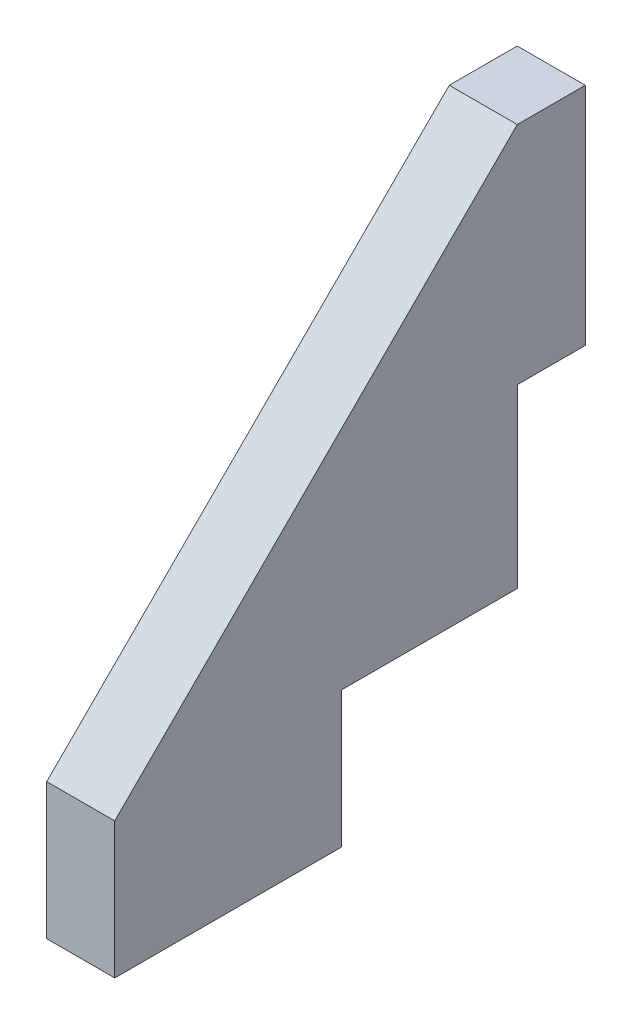
ISO-10303-21;
HEADER;
FILE_DESCRIPTION(('STEP AP214'),'2;1');
FILE_NAME('part.step','',(''),(''),'','','');
FILE_SCHEMA(('AUTOMOTIVE_DESIGN { 1 0 10303 214 1 1 1 1 }'));
ENDSEC;
DATA;
#1=APPLICATION_CONTEXT('core data for automotive mechanical design processes');
#2=APPLICATION_PROTOCOL_DEFINITION('international standard','automotive_design',2000,#1);
#3=PRODUCT_CONTEXT('',#1,'mechanical');
#4=PRODUCT('Part','Part','',(#3));
#5=PRODUCT_RELATED_PRODUCT_CATEGORY('part','',(#4));
#6=PRODUCT_DEFINITION_FORMATION('','',#4);
#7=PRODUCT_DEFINITION_CONTEXT('part definition',#1,'design');
#8=PRODUCT_DEFINITION('design','',#6,#7);
#9=PRODUCT_DEFINITION_SHAPE('','',#8);
#10=(LENGTH_UNIT() NAMED_UNIT(*) SI_UNIT(.MILLI.,.METRE.));
#11=(NAMED_UNIT(*) PLANE_ANGLE_UNIT() SI_UNIT($,.RADIAN.));
#12=(NAMED_UNIT(*) SI_UNIT($,.STERADIAN.) SOLID_ANGLE_UNIT());
#13=UNCERTAINTY_MEASURE_WITH_UNIT(LENGTH_MEASURE(1.E-05),#10,'distance_accuracy_value','');
#14=(GEOMETRIC_REPRESENTATION_CONTEXT(3) GLOBAL_UNCERTAINTY_ASSIGNED_CONTEXT((#13)) GLOBAL_UNIT_ASSIGNED_CONTEXT((#10,
#11,#12)) REPRESENTATION_CONTEXT('',''));
#15=CARTESIAN_POINT('',(0.,0.,0.));
#16=DIRECTION('',(0.,0.,1.));
#17=DIRECTION('',(1.,0.,0.));
#18=AXIS2_PLACEMENT_3D('',#15,#16,#17);
#19=CARTESIAN_POINT('',(3.,1.49999750889235,1.49726626322706));
#20=DIRECTION('',(0.,0.707750835810865,0.706462139402404));
#21=DIRECTION('',(0.,-0.706462139402404,0.707750835810865));
#22=AXIS2_PLACEMENT_3D('',#19,#20,#21);
#23=PLANE('',#22);
#24=DIRECTION('',(0.,0.706462139402404,-0.707750835810865));
#25=VECTOR('',#24,1.);
#26=CARTESIAN_POINT('',(0.,1.49999750889235,1.49726626322706));
#27=LINE('',#26,#25);
#28=CARTESIAN_POINT('',(0.,-17.7176802059527,20.75));
#29=VERTEX_POINT('',#28);
#30=CARTESIAN_POINT('',(0.,0.,3.));
#31=VERTEX_POINT('',#30);
#32=EDGE_CURVE('E133',#29,#31,#27,.T.);
#33=ORIENTED_EDGE('',*,*,#32,.F.);
#34=DIRECTION('',(-1.,0.,0.));
#35=VECTOR('',#34,1.);
#36=CARTESIAN_POINT('',(3.,-17.7176802059527,20.75));
#37=LINE('',#36,#35);
#38=CARTESIAN_POINT('',(3.,-17.7176802059527,20.75));
#39=VERTEX_POINT('',#38);
#40=EDGE_CURVE('E11',#39,#29,#37,.T.);
#41=ORIENTED_EDGE('',*,*,#40,.F.);
#42=DIRECTION('',(0.,0.706462139402404,-0.707750835810865));
#43=VECTOR('',#42,1.);
#44=CARTESIAN_POINT('',(3.,1.49999750889235,1.49726626322706));
#45=LINE('',#44,#43);
#46=CARTESIAN_POINT('',(3.,0.,3.));
#47=VERTEX_POINT('',#46);
#48=EDGE_CURVE('E155',#39,#47,#45,.T.);
#49=ORIENTED_EDGE('',*,*,#48,.T.);
#50=DIRECTION('',(-1.,0.,0.));
#51=VECTOR('',#50,1.);
#52=CARTESIAN_POINT('',(3.,0.,3.));
#53=LINE('',#52,#51);
#54=EDGE_CURVE('E87',#47,#31,#53,.T.);
#55=ORIENTED_EDGE('',*,*,#54,.T.);
#56=EDGE_LOOP('',(#33,#41,#49,#55));
#57=FACE_BOUND('',#56,.T.);
#58=ADVANCED_FACE('F34',(#57),#23,.T.);
#59=CARTESIAN_POINT('',(3.,0.,20.75));
#60=DIRECTION('',(0.,0.,-1.));
#61=DIRECTION('',(-1.,0.,0.));
#62=AXIS2_PLACEMENT_3D('',#59,#60,#61);
#63=PLANE('',#62);
#64=DIRECTION('',(0.,-1.,0.));
#65=VECTOR('',#64,1.);
#66=CARTESIAN_POINT('',(0.,0.,20.75));
#67=LINE('',#66,#65);
#68=CARTESIAN_POINT('',(0.,-23.7176802059527,20.75));
#69=VERTEX_POINT('',#68);
#70=EDGE_CURVE('E136',#29,#69,#67,.T.);
#71=ORIENTED_EDGE('',*,*,#70,.T.);
#72=DIRECTION('',(-1.,0.,0.));
#73=VECTOR('',#72,1.);
#74=CARTESIAN_POINT('',(3.,-23.7176802059527,20.75));
#75=LINE('',#74,#73);
#76=CARTESIAN_POINT('',(3.,-23.7176802059527,20.75));
#77=VERTEX_POINT('',#76);
#78=EDGE_CURVE('E42',#77,#69,#75,.T.);
#79=ORIENTED_EDGE('',*,*,#78,.F.);
#80=DIRECTION('',(0.,-1.,0.));
#81=VECTOR('',#80,1.);
#82=CARTESIAN_POINT('',(3.,0.,20.75));
#83=LINE('',#82,#81);
#84=EDGE_CURVE('E187',#39,#77,#83,.T.);
#85=ORIENTED_EDGE('',*,*,#84,.F.);
#86=ORIENTED_EDGE('',*,*,#40,.T.);
#87=EDGE_LOOP('',(#71,#79,#85,#86));
#88=FACE_BOUND('',#87,.T.);
#89=ADVANCED_FACE('F196',(#88),#63,.F.);
#90=CARTESIAN_POINT('',(3.,-23.7176802059527,0.));
#91=DIRECTION('',(0.,1.,0.));
#92=DIRECTION('',(0.,0.,1.));
#93=AXIS2_PLACEMENT_3D('',#90,#91,#92);
#94=PLANE('',#93);
#95=DIRECTION('',(0.,0.,-1.));
#96=VECTOR('',#95,1.);
#97=CARTESIAN_POINT('',(0.,-23.7176802059527,0.));
#98=LINE('',#97,#96);
#99=CARTESIAN_POINT('',(0.,-23.7176802059527,10.75));
#100=VERTEX_POINT('',#99);
#101=EDGE_CURVE('E138',#69,#100,#98,.T.);
#102=ORIENTED_EDGE('',*,*,#101,.T.);
#103=DIRECTION('',(-1.,0.,0.));
#104=VECTOR('',#103,1.);
#105=CARTESIAN_POINT('',(3.,-23.7176802059527,10.75));
#106=LINE('',#105,#104);
#107=CARTESIAN_POINT('',(3.,-23.7176802059527,10.75));
#108=VERTEX_POINT('',#107);
#109=EDGE_CURVE('E163',#108,#100,#106,.T.);
#110=ORIENTED_EDGE('',*,*,#109,.F.);
#111=DIRECTION('',(0.,0.,-1.));
#112=VECTOR('',#111,1.);
#113=CARTESIAN_POINT('',(3.,-23.7176802059527,0.));
#114=LINE('',#113,#112);
#115=EDGE_CURVE('E171',#77,#108,#114,.T.);
#116=ORIENTED_EDGE('',*,*,#115,.F.);
#117=ORIENTED_EDGE('',*,*,#78,.T.);
#118=EDGE_LOOP('',(#102,#110,#116,#117));
#119=FACE_BOUND('',#118,.T.);
#120=ADVANCED_FACE('F169',(#119),#94,.F.);
#121=CARTESIAN_POINT('',(3.,0.,10.75));
#122=DIRECTION('',(0.,0.,-1.));
#123=DIRECTION('',(-1.,0.,0.));
#124=AXIS2_PLACEMENT_3D('',#121,#122,#123);
#125=PLANE('',#124);
#126=DIRECTION('',(0.,-1.,0.));
#127=VECTOR('',#126,1.);
#128=CARTESIAN_POINT('',(0.,0.,10.75));
#129=LINE('',#128,#127);
#130=CARTESIAN_POINT('',(0.,-17.7176802059527,10.75));
#131=VERTEX_POINT('',#130);
#132=EDGE_CURVE('E141',#131,#100,#129,.T.);
#133=ORIENTED_EDGE('',*,*,#132,.F.);
#134=DIRECTION('',(-1.,0.,0.));
#135=VECTOR('',#134,1.);
#136=CARTESIAN_POINT('',(3.,-17.7176802059527,10.75));
#137=LINE('',#136,#135);
#138=CARTESIAN_POINT('',(3.,-17.7176802059527,10.75));
#139=VERTEX_POINT('',#138);
#140=EDGE_CURVE('E161',#139,#131,#137,.T.);
#141=ORIENTED_EDGE('',*,*,#140,.F.);
#142=DIRECTION('',(0.,-1.,0.));
#143=VECTOR('',#142,1.);
#144=CARTESIAN_POINT('',(3.,0.,10.75));
#145=LINE('',#144,#143);
#146=EDGE_CURVE('E183',#139,#108,#145,.T.);
#147=ORIENTED_EDGE('',*,*,#146,.T.);
#148=ORIENTED_EDGE('',*,*,#109,.T.);
#149=EDGE_LOOP('',(#133,#141,#147,#148));
#150=FACE_BOUND('',#149,.T.);
#151=ADVANCED_FACE('F179',(#150),#125,.T.);
#152=CARTESIAN_POINT('',(3.,-17.7176802059527,0.));
#153=DIRECTION('',(0.,1.,0.));
#154=DIRECTION('',(0.,0.,1.));
#155=AXIS2_PLACEMENT_3D('',#152,#153,#154);
#156=PLANE('',#155);
#157=DIRECTION('',(0.,0.,-1.));
#158=VECTOR('',#157,1.);
#159=CARTESIAN_POINT('',(0.,-17.7176802059527,0.));
#160=LINE('',#159,#158);
#161=CARTESIAN_POINT('',(0.,-17.7176802059527,3.));
#162=VERTEX_POINT('',#161);
#163=EDGE_CURVE('E144',#131,#162,#160,.T.);
#164=ORIENTED_EDGE('',*,*,#163,.T.);
#165=DIRECTION('',(-1.,0.,0.));
#166=VECTOR('',#165,1.);
#167=CARTESIAN_POINT('',(3.,-17.7176802059527,3.));
#168=LINE('',#167,#166);
#169=CARTESIAN_POINT('',(3.,-17.7176802059527,3.));
#170=VERTEX_POINT('',#169);
#171=EDGE_CURVE('E159',#170,#162,#168,.T.);
#172=ORIENTED_EDGE('',*,*,#171,.F.);
#173=DIRECTION('',(0.,0.,-1.));
#174=VECTOR('',#173,1.);
#175=CARTESIAN_POINT('',(3.,-17.7176802059527,0.));
#176=LINE('',#175,#174);
#177=EDGE_CURVE('E184',#139,#170,#176,.T.);
#178=ORIENTED_EDGE('',*,*,#177,.F.);
#179=ORIENTED_EDGE('',*,*,#140,.T.);
#180=EDGE_LOOP('',(#164,#172,#178,#179));
#181=FACE_BOUND('',#180,.T.);
#182=ADVANCED_FACE('F206',(#181),#156,.F.);
#183=CARTESIAN_POINT('',(3.,0.,3.));
#184=DIRECTION('',(0.,0.,-1.));
#185=DIRECTION('',(0.,1.,0.));
#186=AXIS2_PLACEMENT_3D('',#183,#184,#185);
#187=PLANE('',#186);
#188=DIRECTION('',(0.,-1.,0.));
#189=VECTOR('',#188,1.);
#190=CARTESIAN_POINT('',(0.,0.,3.));
#191=LINE('',#190,#189);
#192=CARTESIAN_POINT('',(0.,-9.93536041190545,3.));
#193=VERTEX_POINT('',#192);
#194=EDGE_CURVE('E147',#193,#162,#191,.T.);
#195=ORIENTED_EDGE('',*,*,#194,.F.);
#196=DIRECTION('',(-1.,0.,0.));
#197=VECTOR('',#196,1.);
#198=CARTESIAN_POINT('',(3.,-9.93536041190545,3.));
#199=LINE('',#198,#197);
#200=CARTESIAN_POINT('',(3.,-9.93536041190545,3.));
#201=VERTEX_POINT('',#200);
#202=EDGE_CURVE('E120',#201,#193,#199,.T.);
#203=ORIENTED_EDGE('',*,*,#202,.F.);
#204=DIRECTION('',(0.,-1.,0.));
#205=VECTOR('',#204,1.);
#206=CARTESIAN_POINT('',(3.,0.,3.));
#207=LINE('',#206,#205);
#208=EDGE_CURVE('E126',#201,#170,#207,.T.);
#209=ORIENTED_EDGE('',*,*,#208,.T.);
#210=ORIENTED_EDGE('',*,*,#171,.T.);
#211=EDGE_LOOP('',(#195,#203,#209,#210));
#212=FACE_BOUND('',#211,.T.);
#213=ADVANCED_FACE('F192',(#212),#187,.T.);
#214=CARTESIAN_POINT('',(3.,-9.93536041190545,0.));
#215=DIRECTION('',(0.,-1.,0.));
#216=DIRECTION('',(0.,0.,-1.));
#217=AXIS2_PLACEMENT_3D('',#214,#215,#216);
#218=PLANE('',#217);
#219=DIRECTION('',(0.,0.,1.));
#220=VECTOR('',#219,1.);
#221=CARTESIAN_POINT('',(0.,-9.93536041190545,0.));
#222=LINE('',#221,#220);
#223=CARTESIAN_POINT('',(0.,-9.93536041190545,0.));
#224=VERTEX_POINT('',#223);
#225=EDGE_CURVE('E115',#224,#193,#222,.T.);
#226=ORIENTED_EDGE('',*,*,#225,.F.);
#227=DIRECTION('',(-1.,0.,0.));
#228=VECTOR('',#227,1.);
#229=CARTESIAN_POINT('',(3.,-9.93536041190545,0.));
#230=LINE('',#229,#228);
#231=CARTESIAN_POINT('',(3.,-9.93536041190545,0.));
#232=VERTEX_POINT('',#231);
#233=EDGE_CURVE('E110',#232,#224,#230,.T.);
#234=ORIENTED_EDGE('',*,*,#233,.F.);
#235=DIRECTION('',(0.,0.,1.));
#236=VECTOR('',#235,1.);
#237=CARTESIAN_POINT('',(3.,-9.93536041190545,0.));
#238=LINE('',#237,#236);
#239=EDGE_CURVE('E113',#232,#201,#238,.T.);
#240=ORIENTED_EDGE('',*,*,#239,.T.);
#241=ORIENTED_EDGE('',*,*,#202,.T.);
#242=EDGE_LOOP('',(#226,#234,#240,#241));
#243=FACE_BOUND('',#242,.T.);
#244=ADVANCED_FACE('F112',(#243),#218,.T.);
#245=CARTESIAN_POINT('',(3.,0.,0.));
#246=DIRECTION('',(0.,0.,-1.));
#247=DIRECTION('',(0.,1.,0.));
#248=AXIS2_PLACEMENT_3D('',#245,#246,#247);
#249=PLANE('',#248);
#250=DIRECTION('',(0.,-1.,0.));
#251=VECTOR('',#250,1.);
#252=CARTESIAN_POINT('',(0.,0.,0.));
#253=LINE('',#252,#251);
#254=CARTESIAN_POINT('',(0.,0.,0.));
#255=VERTEX_POINT('',#254);
#256=EDGE_CURVE('E151',#255,#224,#253,.T.);
#257=ORIENTED_EDGE('',*,*,#256,.F.);
#258=DIRECTION('',(-1.,0.,0.));
#259=VECTOR('',#258,1.);
#260=CARTESIAN_POINT('',(3.,0.,0.));
#261=LINE('',#260,#259);
#262=CARTESIAN_POINT('',(3.,0.,0.));
#263=VERTEX_POINT('',#262);
#264=EDGE_CURVE('E80',#263,#255,#261,.T.);
#265=ORIENTED_EDGE('',*,*,#264,.F.);
#266=DIRECTION('',(0.,-1.,0.));
#267=VECTOR('',#266,1.);
#268=CARTESIAN_POINT('',(3.,0.,0.));
#269=LINE('',#268,#267);
#270=EDGE_CURVE('E124',#263,#232,#269,.T.);
#271=ORIENTED_EDGE('',*,*,#270,.T.);
#272=ORIENTED_EDGE('',*,*,#233,.T.);
#273=EDGE_LOOP('',(#257,#265,#271,#272));
#274=FACE_BOUND('',#273,.T.);
#275=ADVANCED_FACE('F128',(#274),#249,.T.);
#276=CARTESIAN_POINT('',(3.,0.,0.));
#277=DIRECTION('',(0.,-1.,0.));
#278=DIRECTION('',(0.,0.,-1.));
#279=AXIS2_PLACEMENT_3D('',#276,#277,#278);
#280=PLANE('',#279);
#281=DIRECTION('',(0.,0.,1.));
#282=VECTOR('',#281,1.);
#283=CARTESIAN_POINT('',(0.,0.,0.));
#284=LINE('',#283,#282);
#285=EDGE_CURVE('E153',#255,#31,#284,.T.);
#286=ORIENTED_EDGE('',*,*,#285,.T.);
#287=ORIENTED_EDGE('',*,*,#54,.F.);
#288=DIRECTION('',(0.,0.,1.));
#289=VECTOR('',#288,1.);
#290=CARTESIAN_POINT('',(3.,0.,0.));
#291=LINE('',#290,#289);
#292=EDGE_CURVE('E50',#263,#47,#291,.T.);
#293=ORIENTED_EDGE('',*,*,#292,.F.);
#294=ORIENTED_EDGE('',*,*,#264,.T.);
#295=EDGE_LOOP('',(#286,#287,#293,#294));
#296=FACE_BOUND('',#295,.T.);
#297=ADVANCED_FACE('F194',(#296),#280,.F.);
#298=CARTESIAN_POINT('',(3.,0.,0.));
#299=DIRECTION('',(1.,0.,0.));
#300=DIRECTION('',(0.,0.,-1.));
#301=AXIS2_PLACEMENT_3D('',#298,#299,#300);
#302=PLANE('',#301);
#303=ORIENTED_EDGE('',*,*,#48,.F.);
#304=ORIENTED_EDGE('',*,*,#84,.T.);
#305=ORIENTED_EDGE('',*,*,#115,.T.);
#306=ORIENTED_EDGE('',*,*,#146,.F.);
#307=ORIENTED_EDGE('',*,*,#177,.T.);
#308=ORIENTED_EDGE('',*,*,#208,.F.);
#309=ORIENTED_EDGE('',*,*,#239,.F.);
#310=ORIENTED_EDGE('',*,*,#270,.F.);
#311=ORIENTED_EDGE('',*,*,#292,.T.);
#312=EDGE_LOOP('',(#303,#304,#305,#306,#307,#308,#309,#310,#311));
#313=FACE_BOUND('',#312,.T.);
#314=ADVANCED_FACE('F123',(#313),#302,.T.);
#315=CARTESIAN_POINT('',(0.,0.,0.));
#316=DIRECTION('',(1.,0.,0.));
#317=DIRECTION('',(0.,0.,-1.));
#318=AXIS2_PLACEMENT_3D('',#315,#316,#317);
#319=PLANE('',#318);
#320=ORIENTED_EDGE('',*,*,#32,.T.);
#321=ORIENTED_EDGE('',*,*,#285,.F.);
#322=ORIENTED_EDGE('',*,*,#256,.T.);
#323=ORIENTED_EDGE('',*,*,#225,.T.);
#324=ORIENTED_EDGE('',*,*,#194,.T.);
#325=ORIENTED_EDGE('',*,*,#163,.F.);
#326=ORIENTED_EDGE('',*,*,#132,.T.);
#327=ORIENTED_EDGE('',*,*,#101,.F.);
#328=ORIENTED_EDGE('',*,*,#70,.F.);
#329=EDGE_LOOP('',(#320,#321,#322,#323,#324,#325,#326,#327,#328));
#330=FACE_BOUND('',#329,.T.);
#331=ADVANCED_FACE('F175',(#330),#319,.F.);
#332=CLOSED_SHELL('',(#58,#89,#120,#151,#182,#213,#244,#275,#297,#314,#331));
#333=MANIFOLD_SOLID_BREP('B2',#332);
#334=ADVANCED_BREP_SHAPE_REPRESENTATION('',(#18,#333),#14);
#335=SHAPE_DEFINITION_REPRESENTATION(#9,#334);
ENDSEC;
END-ISO-10303-21;
